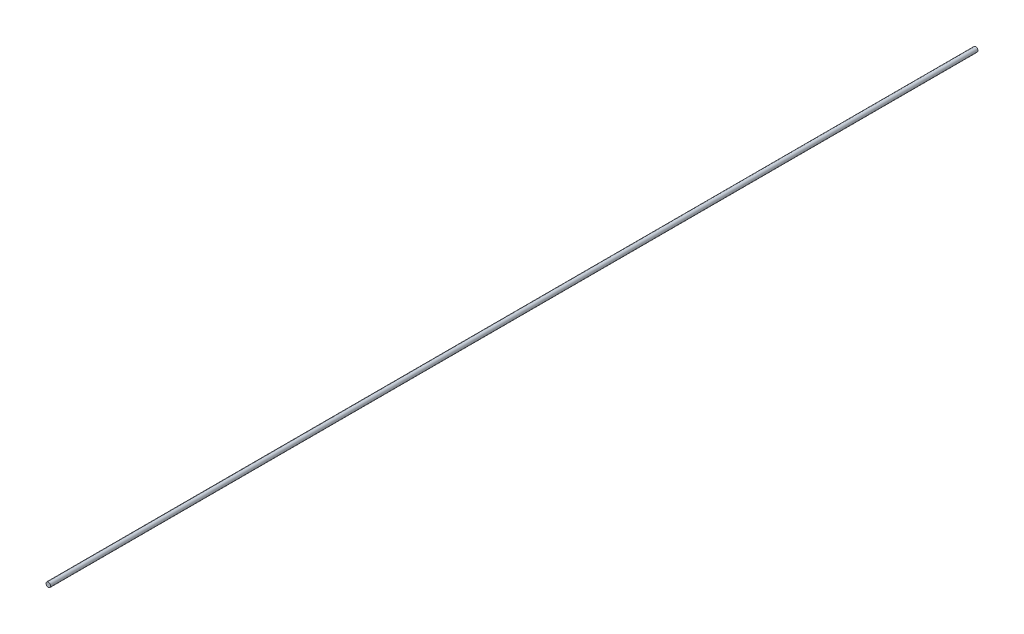
ISO-10303-21;
HEADER;
FILE_DESCRIPTION(('STEP AP214'),'2;1');
FILE_NAME('part.step','',(''),(''),'','','');
FILE_SCHEMA(('AUTOMOTIVE_DESIGN { 1 0 10303 214 1 1 1 1 }'));
ENDSEC;
DATA;
#1=APPLICATION_CONTEXT('core data for automotive mechanical design processes');
#2=APPLICATION_PROTOCOL_DEFINITION('international standard','automotive_design',2000,#1);
#3=PRODUCT_CONTEXT('',#1,'mechanical');
#4=PRODUCT('Part','Part','',(#3));
#5=PRODUCT_RELATED_PRODUCT_CATEGORY('part','',(#4));
#6=PRODUCT_DEFINITION_FORMATION('','',#4);
#7=PRODUCT_DEFINITION_CONTEXT('part definition',#1,'design');
#8=PRODUCT_DEFINITION('design','',#6,#7);
#9=PRODUCT_DEFINITION_SHAPE('','',#8);
#10=(LENGTH_UNIT() NAMED_UNIT(*) SI_UNIT(.MILLI.,.METRE.));
#11=(NAMED_UNIT(*) PLANE_ANGLE_UNIT() SI_UNIT($,.RADIAN.));
#12=(NAMED_UNIT(*) SI_UNIT($,.STERADIAN.) SOLID_ANGLE_UNIT());
#13=UNCERTAINTY_MEASURE_WITH_UNIT(LENGTH_MEASURE(1.E-05),#10,'distance_accuracy_value','');
#14=(GEOMETRIC_REPRESENTATION_CONTEXT(3) GLOBAL_UNCERTAINTY_ASSIGNED_CONTEXT((#13)) GLOBAL_UNIT_ASSIGNED_CONTEXT((#10,
#11,#12)) REPRESENTATION_CONTEXT('',''));
#15=CARTESIAN_POINT('',(0.,0.,0.));
#16=DIRECTION('',(0.,0.,1.));
#17=DIRECTION('',(1.,0.,0.));
#18=AXIS2_PLACEMENT_3D('',#15,#16,#17);
#19=CARTESIAN_POINT('',(0.,0.,400.));
#20=DIRECTION('',(0.,0.,-1.));
#21=DIRECTION('',(-1.,0.,0.));
#22=AXIS2_PLACEMENT_3D('',#19,#20,#21);
#23=CYLINDRICAL_SURFACE('',#22,1.);
#24=CARTESIAN_POINT('',(0.,0.,400.));
#25=DIRECTION('',(0.,0.,1.));
#26=DIRECTION('',(1.,0.,0.));
#27=AXIS2_PLACEMENT_3D('',#24,#25,#26);
#28=CIRCLE('',#27,1.);
#29=CARTESIAN_POINT('',(1.,0.,400.));
#30=VERTEX_POINT('',#29);
#31=EDGE_CURVE('E10',#30,#30,#28,.T.);
#32=ORIENTED_EDGE('',*,*,#31,.F.);
#33=EDGE_LOOP('',(#32));
#34=FACE_BOUND('',#33,.T.);
#35=CARTESIAN_POINT('',(0.,0.,0.));
#36=DIRECTION('',(0.,0.,1.));
#37=DIRECTION('',(1.,0.,0.));
#38=AXIS2_PLACEMENT_3D('',#35,#36,#37);
#39=CIRCLE('',#38,1.);
#40=CARTESIAN_POINT('',(1.,0.,0.));
#41=VERTEX_POINT('',#40);
#42=EDGE_CURVE('E32',#41,#41,#39,.T.);
#43=ORIENTED_EDGE('',*,*,#42,.T.);
#44=EDGE_LOOP('',(#43));
#45=FACE_BOUND('',#44,.T.);
#46=ADVANCED_FACE('F29',(#34,#45),#23,.T.);
#47=CARTESIAN_POINT('',(0.,0.,400.));
#48=DIRECTION('',(0.,0.,1.));
#49=DIRECTION('',(1.,0.,0.));
#50=AXIS2_PLACEMENT_3D('',#47,#48,#49);
#51=PLANE('',#50);
#52=ORIENTED_EDGE('',*,*,#31,.T.);
#53=EDGE_LOOP('',(#52));
#54=FACE_BOUND('',#53,.T.);
#55=ADVANCED_FACE('F44',(#54),#51,.T.);
#56=CARTESIAN_POINT('',(0.,0.,0.));
#57=DIRECTION('',(0.,0.,1.));
#58=DIRECTION('',(1.,0.,0.));
#59=AXIS2_PLACEMENT_3D('',#56,#57,#58);
#60=PLANE('',#59);
#61=ORIENTED_EDGE('',*,*,#42,.F.);
#62=EDGE_LOOP('',(#61));
#63=FACE_BOUND('',#62,.T.);
#64=ADVANCED_FACE('F42',(#63),#60,.F.);
#65=CLOSED_SHELL('',(#46,#55,#64));
#66=MANIFOLD_SOLID_BREP('B2',#65);
#67=ADVANCED_BREP_SHAPE_REPRESENTATION('',(#18,#66),#14);
#68=SHAPE_DEFINITION_REPRESENTATION(#9,#67);
ENDSEC;
END-ISO-10303-21;
